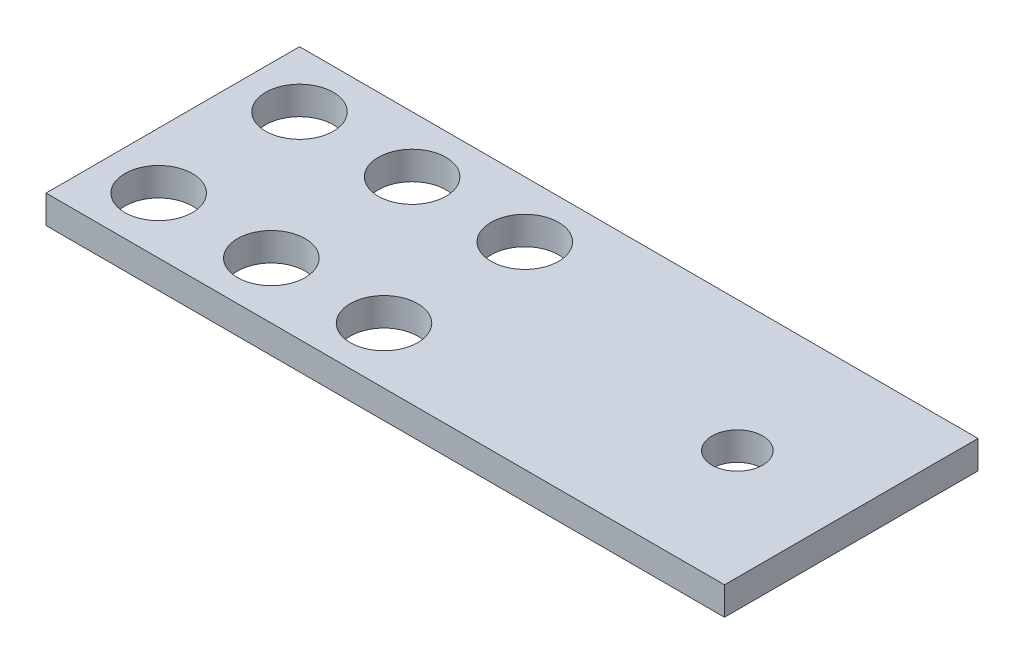
ISO-10303-21;
HEADER;
FILE_DESCRIPTION(('STEP AP214'),'2;1');
FILE_NAME('part.step','',(''),(''),'','','');
FILE_SCHEMA(('AUTOMOTIVE_DESIGN { 1 0 10303 214 1 1 1 1 }'));
ENDSEC;
DATA;
#1=APPLICATION_CONTEXT('core data for automotive mechanical design processes');
#2=APPLICATION_PROTOCOL_DEFINITION('international standard','automotive_design',2000,#1);
#3=PRODUCT_CONTEXT('',#1,'mechanical');
#4=PRODUCT('Part','Part','',(#3));
#5=PRODUCT_RELATED_PRODUCT_CATEGORY('part','',(#4));
#6=PRODUCT_DEFINITION_FORMATION('','',#4);
#7=PRODUCT_DEFINITION_CONTEXT('part definition',#1,'design');
#8=PRODUCT_DEFINITION('design','',#6,#7);
#9=PRODUCT_DEFINITION_SHAPE('','',#8);
#10=(LENGTH_UNIT() NAMED_UNIT(*) SI_UNIT(.MILLI.,.METRE.));
#11=(NAMED_UNIT(*) PLANE_ANGLE_UNIT() SI_UNIT($,.RADIAN.));
#12=(NAMED_UNIT(*) SI_UNIT($,.STERADIAN.) SOLID_ANGLE_UNIT());
#13=UNCERTAINTY_MEASURE_WITH_UNIT(LENGTH_MEASURE(1.E-05),#10,'distance_accuracy_value','');
#14=(GEOMETRIC_REPRESENTATION_CONTEXT(3) GLOBAL_UNCERTAINTY_ASSIGNED_CONTEXT((#13)) GLOBAL_UNIT_ASSIGNED_CONTEXT((#10,
#11,#12)) REPRESENTATION_CONTEXT('',''));
#15=CARTESIAN_POINT('',(0.,0.,0.));
#16=DIRECTION('',(0.,0.,1.));
#17=DIRECTION('',(1.,0.,0.));
#18=AXIS2_PLACEMENT_3D('',#15,#16,#17);
#19=CARTESIAN_POINT('',(-78.4510766403689,69.2187190023275,332.529969028674));
#20=DIRECTION('',(1.,0.,0.));
#21=DIRECTION('',(0.,1.,0.));
#22=AXIS2_PLACEMENT_3D('',#19,#20,#21);
#23=PLANE('',#22);
#24=DIRECTION('',(0.,0.,-1.));
#25=VECTOR('',#24,1.);
#26=CARTESIAN_POINT('',(-78.4510766403689,74.2187190023276,332.529969028674));
#27=LINE('',#26,#25);
#28=CARTESIAN_POINT('',(-78.4510766403689,74.2187190023276,332.529969028674));
#29=VERTEX_POINT('',#28);
#30=CARTESIAN_POINT('',(-78.4510766403689,74.2187190023276,287.529969028674));
#31=VERTEX_POINT('',#30);
#32=EDGE_CURVE('E96',#29,#31,#27,.T.);
#33=ORIENTED_EDGE('',*,*,#32,.T.);
#34=DIRECTION('',(0.,1.,0.));
#35=VECTOR('',#34,1.);
#36=CARTESIAN_POINT('',(-78.4510766403689,69.2187190023275,287.529969028674));
#37=LINE('',#36,#35);
#38=CARTESIAN_POINT('',(-78.4510766403689,69.2187190023275,287.529969028674));
#39=VERTEX_POINT('',#38);
#40=EDGE_CURVE('E11',#39,#31,#37,.T.);
#41=ORIENTED_EDGE('',*,*,#40,.F.);
#42=DIRECTION('',(0.,0.,-1.));
#43=VECTOR('',#42,1.);
#44=CARTESIAN_POINT('',(-78.4510766403689,69.2187190023275,332.529969028674));
#45=LINE('',#44,#43);
#46=CARTESIAN_POINT('',(-78.4510766403689,69.2187190023275,332.529969028674));
#47=VERTEX_POINT('',#46);
#48=EDGE_CURVE('E84',#47,#39,#45,.T.);
#49=ORIENTED_EDGE('',*,*,#48,.F.);
#50=DIRECTION('',(0.,1.,0.));
#51=VECTOR('',#50,1.);
#52=CARTESIAN_POINT('',(-78.4510766403689,69.2187190023275,332.529969028674));
#53=LINE('',#52,#51);
#54=EDGE_CURVE('E92',#47,#29,#53,.T.);
#55=ORIENTED_EDGE('',*,*,#54,.T.);
#56=EDGE_LOOP('',(#33,#41,#49,#55));
#57=FACE_BOUND('',#56,.T.);
#58=ADVANCED_FACE('F33',(#57),#23,.F.);
#59=CARTESIAN_POINT('',(-78.4510766403689,69.2187190023275,287.529969028674));
#60=DIRECTION('',(0.,0.,1.));
#61=DIRECTION('',(0.,-1.,0.));
#62=AXIS2_PLACEMENT_3D('',#59,#60,#61);
#63=PLANE('',#62);
#64=DIRECTION('',(1.,0.,0.));
#65=VECTOR('',#64,1.);
#66=CARTESIAN_POINT('',(-78.4510766403689,74.2187190023276,287.529969028674));
#67=LINE('',#66,#65);
#68=CARTESIAN_POINT('',(42.,74.2187190023276,287.529969028674));
#69=VERTEX_POINT('',#68);
#70=EDGE_CURVE('E88',#31,#69,#67,.T.);
#71=ORIENTED_EDGE('',*,*,#70,.T.);
#72=DIRECTION('',(0.,1.,0.));
#73=VECTOR('',#72,1.);
#74=CARTESIAN_POINT('',(42.,69.2187190023276,287.529969028674));
#75=LINE('',#74,#73);
#76=CARTESIAN_POINT('',(42.,69.2187190023276,287.529969028674));
#77=VERTEX_POINT('',#76);
#78=EDGE_CURVE('E41',#77,#69,#75,.T.);
#79=ORIENTED_EDGE('',*,*,#78,.F.);
#80=DIRECTION('',(1.,0.,0.));
#81=VECTOR('',#80,1.);
#82=CARTESIAN_POINT('',(-78.4510766403689,69.2187190023275,287.529969028674));
#83=LINE('',#82,#81);
#84=EDGE_CURVE('E79',#39,#77,#83,.T.);
#85=ORIENTED_EDGE('',*,*,#84,.F.);
#86=ORIENTED_EDGE('',*,*,#40,.T.);
#87=EDGE_LOOP('',(#71,#79,#85,#86));
#88=FACE_BOUND('',#87,.T.);
#89=ADVANCED_FACE('F87',(#88),#63,.F.);
#90=CARTESIAN_POINT('',(42.,69.2187190023276,332.529969028674));
#91=DIRECTION('',(-1.,0.,0.));
#92=DIRECTION('',(0.,-1.,0.));
#93=AXIS2_PLACEMENT_3D('',#90,#91,#92);
#94=PLANE('',#93);
#95=DIRECTION('',(0.,0.,1.));
#96=VECTOR('',#95,1.);
#97=CARTESIAN_POINT('',(42.,74.2187190023276,332.529969028674));
#98=LINE('',#97,#96);
#99=CARTESIAN_POINT('',(42.,74.2187190023276,332.529969028674));
#100=VERTEX_POINT('',#99);
#101=EDGE_CURVE('E66',#69,#100,#98,.T.);
#102=ORIENTED_EDGE('',*,*,#101,.T.);
#103=DIRECTION('',(0.,1.,0.));
#104=VECTOR('',#103,1.);
#105=CARTESIAN_POINT('',(42.,69.2187190023276,332.529969028674));
#106=LINE('',#105,#104);
#107=CARTESIAN_POINT('',(42.,69.2187190023276,332.529969028674));
#108=VERTEX_POINT('',#107);
#109=EDGE_CURVE('E89',#108,#100,#106,.T.);
#110=ORIENTED_EDGE('',*,*,#109,.F.);
#111=DIRECTION('',(0.,0.,1.));
#112=VECTOR('',#111,1.);
#113=CARTESIAN_POINT('',(42.,69.2187190023276,332.529969028674));
#114=LINE('',#113,#112);
#115=EDGE_CURVE('E82',#77,#108,#114,.T.);
#116=ORIENTED_EDGE('',*,*,#115,.F.);
#117=ORIENTED_EDGE('',*,*,#78,.T.);
#118=EDGE_LOOP('',(#102,#110,#116,#117));
#119=FACE_BOUND('',#118,.T.);
#120=ADVANCED_FACE('F90',(#119),#94,.F.);
#121=CARTESIAN_POINT('',(-78.4510766403689,69.2187190023275,332.529969028674));
#122=DIRECTION('',(0.,0.,-1.));
#123=DIRECTION('',(0.,1.,0.));
#124=AXIS2_PLACEMENT_3D('',#121,#122,#123);
#125=PLANE('',#124);
#126=DIRECTION('',(-1.,0.,0.));
#127=VECTOR('',#126,1.);
#128=CARTESIAN_POINT('',(-78.4510766403689,74.2187190023276,332.529969028674));
#129=LINE('',#128,#127);
#130=EDGE_CURVE('E72',#100,#29,#129,.T.);
#131=ORIENTED_EDGE('',*,*,#130,.T.);
#132=ORIENTED_EDGE('',*,*,#54,.F.);
#133=DIRECTION('',(-1.,0.,0.));
#134=VECTOR('',#133,1.);
#135=CARTESIAN_POINT('',(-78.4510766403689,69.2187190023275,332.529969028674));
#136=LINE('',#135,#134);
#137=EDGE_CURVE('E49',#108,#47,#136,.T.);
#138=ORIENTED_EDGE('',*,*,#137,.F.);
#139=ORIENTED_EDGE('',*,*,#109,.T.);
#140=EDGE_LOOP('',(#131,#132,#138,#139));
#141=FACE_BOUND('',#140,.T.);
#142=ADVANCED_FACE('F104',(#141),#125,.F.);
#143=CARTESIAN_POINT('',(0.,69.2187190023276,0.));
#144=DIRECTION('',(0.,-1.,0.));
#145=DIRECTION('',(1.,0.,0.));
#146=AXIS2_PLACEMENT_3D('',#143,#144,#145);
#147=PLANE('',#146);
#148=CARTESIAN_POINT('',(22.4999999999974,69.2187190023276,310.751020034131));
#149=DIRECTION('',(0.,-1.,0.));
#150=DIRECTION('',(0.,0.,-1.));
#151=AXIS2_PLACEMENT_3D('',#148,#149,#150);
#152=CIRCLE('',#151,4.5);
#153=CARTESIAN_POINT('',(22.4999999999974,69.2187190023276,306.251020034131));
#154=VERTEX_POINT('',#153);
#155=EDGE_CURVE('E148',#154,#154,#152,.T.);
#156=ORIENTED_EDGE('',*,*,#155,.F.);
#157=EDGE_LOOP('',(#156));
#158=FACE_BOUND('',#157,.T.);
#159=CARTESIAN_POINT('',(-68.4510766403689,69.2187190023275,322.529969028674));
#160=DIRECTION('',(0.,1.,0.));
#161=DIRECTION('',(0.,0.,1.));
#162=AXIS2_PLACEMENT_3D('',#159,#160,#161);
#163=CIRCLE('',#162,6.);
#164=CARTESIAN_POINT('',(-68.4510766403689,69.2187190023275,328.529969028674));
#165=VERTEX_POINT('',#164);
#166=EDGE_CURVE('E139',#165,#165,#163,.T.);
#167=ORIENTED_EDGE('',*,*,#166,.T.);
#168=EDGE_LOOP('',(#167));
#169=FACE_BOUND('',#168,.T.);
#170=CARTESIAN_POINT('',(-68.4510766403704,69.2187190023275,297.529969028674));
#171=DIRECTION('',(0.,1.,0.));
#172=DIRECTION('',(0.,0.,1.));
#173=AXIS2_PLACEMENT_3D('',#170,#171,#172);
#174=CIRCLE('',#173,6.);
#175=CARTESIAN_POINT('',(-68.4510766403704,69.2187190023275,303.529969028674));
#176=VERTEX_POINT('',#175);
#177=EDGE_CURVE('E133',#176,#176,#174,.T.);
#178=ORIENTED_EDGE('',*,*,#177,.T.);
#179=EDGE_LOOP('',(#178));
#180=FACE_BOUND('',#179,.T.);
#181=CARTESIAN_POINT('',(-48.4510766403689,69.2187190023275,322.529969028674));
#182=DIRECTION('',(0.,1.,0.));
#183=DIRECTION('',(0.,0.,1.));
#184=AXIS2_PLACEMENT_3D('',#181,#182,#183);
#185=CIRCLE('',#184,6.);
#186=CARTESIAN_POINT('',(-48.4510766403689,69.2187190023275,328.529969028674));
#187=VERTEX_POINT('',#186);
#188=EDGE_CURVE('E127',#187,#187,#185,.T.);
#189=ORIENTED_EDGE('',*,*,#188,.T.);
#190=EDGE_LOOP('',(#189));
#191=FACE_BOUND('',#190,.T.);
#192=CARTESIAN_POINT('',(-28.4510766403689,69.2187190023275,322.529969028674));
#193=DIRECTION('',(0.,1.,0.));
#194=DIRECTION('',(0.,0.,1.));
#195=AXIS2_PLACEMENT_3D('',#192,#193,#194);
#196=CIRCLE('',#195,6.);
#197=CARTESIAN_POINT('',(-28.4510766403689,69.2187190023275,328.529969028674));
#198=VERTEX_POINT('',#197);
#199=EDGE_CURVE('E121',#198,#198,#196,.T.);
#200=ORIENTED_EDGE('',*,*,#199,.T.);
#201=EDGE_LOOP('',(#200));
#202=FACE_BOUND('',#201,.T.);
#203=CARTESIAN_POINT('',(-48.4510766403704,69.2187190023275,297.529969028674));
#204=DIRECTION('',(0.,1.,0.));
#205=DIRECTION('',(0.,0.,1.));
#206=AXIS2_PLACEMENT_3D('',#203,#204,#205);
#207=CIRCLE('',#206,6.);
#208=CARTESIAN_POINT('',(-48.4510766403704,69.2187190023275,303.529969028674));
#209=VERTEX_POINT('',#208);
#210=EDGE_CURVE('E115',#209,#209,#207,.T.);
#211=ORIENTED_EDGE('',*,*,#210,.T.);
#212=EDGE_LOOP('',(#211));
#213=FACE_BOUND('',#212,.T.);
#214=CARTESIAN_POINT('',(-28.4510766403704,69.2187190023275,297.529969028674));
#215=DIRECTION('',(0.,1.,0.));
#216=DIRECTION('',(0.,0.,1.));
#217=AXIS2_PLACEMENT_3D('',#214,#215,#216);
#218=CIRCLE('',#217,6.);
#219=CARTESIAN_POINT('',(-28.4510766403704,69.2187190023275,303.529969028674));
#220=VERTEX_POINT('',#219);
#221=EDGE_CURVE('E99',#220,#220,#218,.T.);
#222=ORIENTED_EDGE('',*,*,#221,.T.);
#223=EDGE_LOOP('',(#222));
#224=FACE_BOUND('',#223,.T.);
#225=ORIENTED_EDGE('',*,*,#48,.T.);
#226=ORIENTED_EDGE('',*,*,#84,.T.);
#227=ORIENTED_EDGE('',*,*,#115,.T.);
#228=ORIENTED_EDGE('',*,*,#137,.T.);
#229=EDGE_LOOP('',(#225,#226,#227,#228));
#230=FACE_BOUND('',#229,.T.);
#231=ADVANCED_FACE('F80',(#158,#169,#180,#191,#202,#213,#224,#230),#147,.T.);
#232=CARTESIAN_POINT('',(0.,74.2187190023276,0.));
#233=DIRECTION('',(0.,-1.,0.));
#234=DIRECTION('',(1.,0.,0.));
#235=AXIS2_PLACEMENT_3D('',#232,#233,#234);
#236=PLANE('',#235);
#237=CARTESIAN_POINT('',(22.4999999999974,74.2187190023276,310.751020034131));
#238=DIRECTION('',(0.,-1.,0.));
#239=DIRECTION('',(0.,0.,-1.));
#240=AXIS2_PLACEMENT_3D('',#237,#238,#239);
#241=CIRCLE('',#240,4.5);
#242=CARTESIAN_POINT('',(22.4999999999974,74.2187190023276,306.251020034131));
#243=VERTEX_POINT('',#242);
#244=EDGE_CURVE('E145',#243,#243,#241,.T.);
#245=ORIENTED_EDGE('',*,*,#244,.T.);
#246=EDGE_LOOP('',(#245));
#247=FACE_BOUND('',#246,.T.);
#248=CARTESIAN_POINT('',(-68.4510766403689,74.2187190023276,322.529969028674));
#249=DIRECTION('',(0.,1.,0.));
#250=DIRECTION('',(0.,0.,1.));
#251=AXIS2_PLACEMENT_3D('',#248,#249,#250);
#252=CIRCLE('',#251,6.);
#253=CARTESIAN_POINT('',(-68.4510766403689,74.2187190023276,328.529969028674));
#254=VERTEX_POINT('',#253);
#255=EDGE_CURVE('E142',#254,#254,#252,.T.);
#256=ORIENTED_EDGE('',*,*,#255,.F.);
#257=EDGE_LOOP('',(#256));
#258=FACE_BOUND('',#257,.T.);
#259=CARTESIAN_POINT('',(-68.4510766403704,74.2187190023276,297.529969028674));
#260=DIRECTION('',(0.,1.,0.));
#261=DIRECTION('',(0.,0.,1.));
#262=AXIS2_PLACEMENT_3D('',#259,#260,#261);
#263=CIRCLE('',#262,6.);
#264=CARTESIAN_POINT('',(-68.4510766403704,74.2187190023276,303.529969028674));
#265=VERTEX_POINT('',#264);
#266=EDGE_CURVE('E136',#265,#265,#263,.T.);
#267=ORIENTED_EDGE('',*,*,#266,.F.);
#268=EDGE_LOOP('',(#267));
#269=FACE_BOUND('',#268,.T.);
#270=CARTESIAN_POINT('',(-48.4510766403689,74.2187190023276,322.529969028674));
#271=DIRECTION('',(0.,1.,0.));
#272=DIRECTION('',(0.,0.,1.));
#273=AXIS2_PLACEMENT_3D('',#270,#271,#272);
#274=CIRCLE('',#273,6.);
#275=CARTESIAN_POINT('',(-48.4510766403689,74.2187190023276,328.529969028674));
#276=VERTEX_POINT('',#275);
#277=EDGE_CURVE('E130',#276,#276,#274,.T.);
#278=ORIENTED_EDGE('',*,*,#277,.F.);
#279=EDGE_LOOP('',(#278));
#280=FACE_BOUND('',#279,.T.);
#281=CARTESIAN_POINT('',(-28.4510766403689,74.2187190023276,322.529969028674));
#282=DIRECTION('',(0.,1.,0.));
#283=DIRECTION('',(0.,0.,1.));
#284=AXIS2_PLACEMENT_3D('',#281,#282,#283);
#285=CIRCLE('',#284,6.);
#286=CARTESIAN_POINT('',(-28.4510766403689,74.2187190023276,328.529969028674));
#287=VERTEX_POINT('',#286);
#288=EDGE_CURVE('E124',#287,#287,#285,.T.);
#289=ORIENTED_EDGE('',*,*,#288,.F.);
#290=EDGE_LOOP('',(#289));
#291=FACE_BOUND('',#290,.T.);
#292=CARTESIAN_POINT('',(-48.4510766403704,74.2187190023276,297.529969028674));
#293=DIRECTION('',(0.,1.,0.));
#294=DIRECTION('',(0.,0.,1.));
#295=AXIS2_PLACEMENT_3D('',#292,#293,#294);
#296=CIRCLE('',#295,6.);
#297=CARTESIAN_POINT('',(-48.4510766403704,74.2187190023276,303.529969028674));
#298=VERTEX_POINT('',#297);
#299=EDGE_CURVE('E118',#298,#298,#296,.T.);
#300=ORIENTED_EDGE('',*,*,#299,.F.);
#301=EDGE_LOOP('',(#300));
#302=FACE_BOUND('',#301,.T.);
#303=CARTESIAN_POINT('',(-28.4510766403704,74.2187190023276,297.529969028674));
#304=DIRECTION('',(0.,1.,0.));
#305=DIRECTION('',(0.,0.,1.));
#306=AXIS2_PLACEMENT_3D('',#303,#304,#305);
#307=CIRCLE('',#306,6.);
#308=CARTESIAN_POINT('',(-28.4510766403704,74.2187190023276,303.529969028674));
#309=VERTEX_POINT('',#308);
#310=EDGE_CURVE('E112',#309,#309,#307,.T.);
#311=ORIENTED_EDGE('',*,*,#310,.F.);
#312=EDGE_LOOP('',(#311));
#313=FACE_BOUND('',#312,.T.);
#314=ORIENTED_EDGE('',*,*,#32,.F.);
#315=ORIENTED_EDGE('',*,*,#130,.F.);
#316=ORIENTED_EDGE('',*,*,#101,.F.);
#317=ORIENTED_EDGE('',*,*,#70,.F.);
#318=EDGE_LOOP('',(#314,#315,#316,#317));
#319=FACE_BOUND('',#318,.T.);
#320=ADVANCED_FACE('F107',(#247,#258,#269,#280,#291,#302,#313,#319),#236,.F.);
#321=CARTESIAN_POINT('',(-28.4510766403704,74.2187190023276,297.529969028674));
#322=DIRECTION('',(0.,1.,0.));
#323=DIRECTION('',(0.,0.,1.));
#324=AXIS2_PLACEMENT_3D('',#321,#322,#323);
#325=CYLINDRICAL_SURFACE('',#324,6.);
#326=ORIENTED_EDGE('',*,*,#221,.F.);
#327=EDGE_LOOP('',(#326));
#328=FACE_BOUND('',#327,.T.);
#329=ORIENTED_EDGE('',*,*,#310,.T.);
#330=EDGE_LOOP('',(#329));
#331=FACE_BOUND('',#330,.T.);
#332=ADVANCED_FACE('F169',(#328,#331),#325,.F.);
#333=CARTESIAN_POINT('',(-48.4510766403704,74.2187190023276,297.529969028674));
#334=DIRECTION('',(0.,1.,0.));
#335=DIRECTION('',(0.,0.,1.));
#336=AXIS2_PLACEMENT_3D('',#333,#334,#335);
#337=CYLINDRICAL_SURFACE('',#336,6.);
#338=ORIENTED_EDGE('',*,*,#210,.F.);
#339=EDGE_LOOP('',(#338));
#340=FACE_BOUND('',#339,.T.);
#341=ORIENTED_EDGE('',*,*,#299,.T.);
#342=EDGE_LOOP('',(#341));
#343=FACE_BOUND('',#342,.T.);
#344=ADVANCED_FACE('F172',(#340,#343),#337,.F.);
#345=CARTESIAN_POINT('',(-28.4510766403689,74.2187190023276,322.529969028674));
#346=DIRECTION('',(0.,1.,0.));
#347=DIRECTION('',(0.,0.,1.));
#348=AXIS2_PLACEMENT_3D('',#345,#346,#347);
#349=CYLINDRICAL_SURFACE('',#348,6.);
#350=ORIENTED_EDGE('',*,*,#199,.F.);
#351=EDGE_LOOP('',(#350));
#352=FACE_BOUND('',#351,.T.);
#353=ORIENTED_EDGE('',*,*,#288,.T.);
#354=EDGE_LOOP('',(#353));
#355=FACE_BOUND('',#354,.T.);
#356=ADVANCED_FACE('F240',(#352,#355),#349,.F.);
#357=CARTESIAN_POINT('',(-48.4510766403689,74.2187190023276,322.529969028674));
#358=DIRECTION('',(0.,1.,0.));
#359=DIRECTION('',(0.,0.,1.));
#360=AXIS2_PLACEMENT_3D('',#357,#358,#359);
#361=CYLINDRICAL_SURFACE('',#360,6.);
#362=ORIENTED_EDGE('',*,*,#188,.F.);
#363=EDGE_LOOP('',(#362));
#364=FACE_BOUND('',#363,.T.);
#365=ORIENTED_EDGE('',*,*,#277,.T.);
#366=EDGE_LOOP('',(#365));
#367=FACE_BOUND('',#366,.T.);
#368=ADVANCED_FACE('F232',(#364,#367),#361,.F.);
#369=CARTESIAN_POINT('',(-68.4510766403704,74.2187190023276,297.529969028674));
#370=DIRECTION('',(0.,1.,0.));
#371=DIRECTION('',(0.,0.,1.));
#372=AXIS2_PLACEMENT_3D('',#369,#370,#371);
#373=CYLINDRICAL_SURFACE('',#372,6.);
#374=ORIENTED_EDGE('',*,*,#177,.F.);
#375=EDGE_LOOP('',(#374));
#376=FACE_BOUND('',#375,.T.);
#377=ORIENTED_EDGE('',*,*,#266,.T.);
#378=EDGE_LOOP('',(#377));
#379=FACE_BOUND('',#378,.T.);
#380=ADVANCED_FACE('F227',(#376,#379),#373,.F.);
#381=CARTESIAN_POINT('',(-68.4510766403689,74.2187190023276,322.529969028674));
#382=DIRECTION('',(0.,1.,0.));
#383=DIRECTION('',(0.,0.,1.));
#384=AXIS2_PLACEMENT_3D('',#381,#382,#383);
#385=CYLINDRICAL_SURFACE('',#384,6.);
#386=ORIENTED_EDGE('',*,*,#166,.F.);
#387=EDGE_LOOP('',(#386));
#388=FACE_BOUND('',#387,.T.);
#389=ORIENTED_EDGE('',*,*,#255,.T.);
#390=EDGE_LOOP('',(#389));
#391=FACE_BOUND('',#390,.T.);
#392=ADVANCED_FACE('F207',(#388,#391),#385,.F.);
#393=CARTESIAN_POINT('',(22.4999999999974,69.2187190023276,310.751020034131));
#394=DIRECTION('',(0.,-1.,0.));
#395=DIRECTION('',(0.,0.,-1.));
#396=AXIS2_PLACEMENT_3D('',#393,#394,#395);
#397=CYLINDRICAL_SURFACE('',#396,4.5);
#398=ORIENTED_EDGE('',*,*,#244,.F.);
#399=EDGE_LOOP('',(#398));
#400=FACE_BOUND('',#399,.T.);
#401=ORIENTED_EDGE('',*,*,#155,.T.);
#402=EDGE_LOOP('',(#401));
#403=FACE_BOUND('',#402,.T.);
#404=ADVANCED_FACE('F152',(#400,#403),#397,.F.);
#405=CLOSED_SHELL('',(#58,#89,#120,#142,#231,#320,#332,#344,#356,#368,#380,#392,#404));
#406=MANIFOLD_SOLID_BREP('B2',#405);
#407=ADVANCED_BREP_SHAPE_REPRESENTATION('',(#18,#406),#14);
#408=SHAPE_DEFINITION_REPRESENTATION(#9,#407);
ENDSEC;
END-ISO-10303-21;
